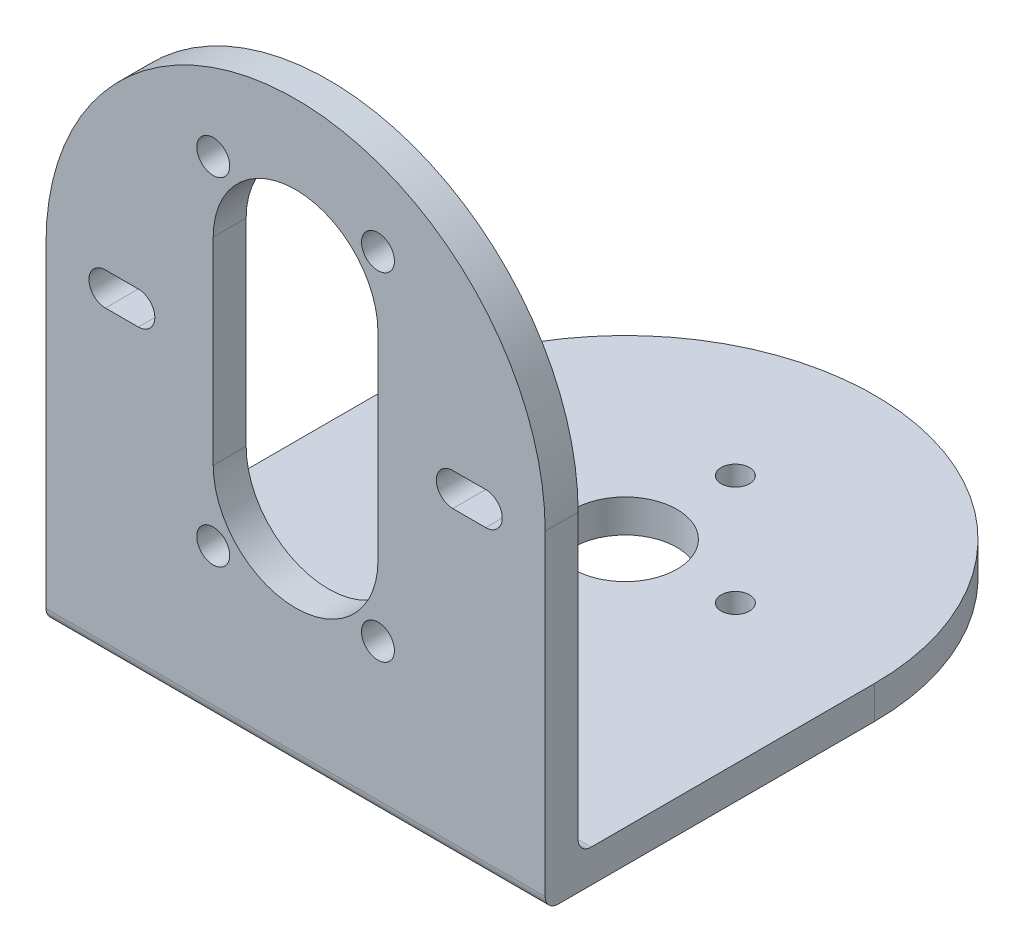
ISO-10303-21;
HEADER;
FILE_DESCRIPTION(('STEP AP214'),'2;1');
FILE_NAME('part.step','',(''),(''),'','','');
FILE_SCHEMA(('AUTOMOTIVE_DESIGN { 1 0 10303 214 1 1 1 1 }'));
ENDSEC;
DATA;
#1=APPLICATION_CONTEXT('core data for automotive mechanical design processes');
#2=APPLICATION_PROTOCOL_DEFINITION('international standard','automotive_design',2000,#1);
#3=PRODUCT_CONTEXT('',#1,'mechanical');
#4=PRODUCT('Part','Part','',(#3));
#5=PRODUCT_RELATED_PRODUCT_CATEGORY('part','',(#4));
#6=PRODUCT_DEFINITION_FORMATION('','',#4);
#7=PRODUCT_DEFINITION_CONTEXT('part definition',#1,'design');
#8=PRODUCT_DEFINITION('design','',#6,#7);
#9=PRODUCT_DEFINITION_SHAPE('','',#8);
#10=(LENGTH_UNIT() NAMED_UNIT(*) SI_UNIT(.MILLI.,.METRE.));
#11=(NAMED_UNIT(*) PLANE_ANGLE_UNIT() SI_UNIT($,.RADIAN.));
#12=(NAMED_UNIT(*) SI_UNIT($,.STERADIAN.) SOLID_ANGLE_UNIT());
#13=UNCERTAINTY_MEASURE_WITH_UNIT(LENGTH_MEASURE(1.E-05),#10,'distance_accuracy_value','');
#14=(GEOMETRIC_REPRESENTATION_CONTEXT(3) GLOBAL_UNCERTAINTY_ASSIGNED_CONTEXT((#13)) GLOBAL_UNIT_ASSIGNED_CONTEXT((#10,
#11,#12)) REPRESENTATION_CONTEXT('',''));
#15=CARTESIAN_POINT('',(0.,0.,0.));
#16=DIRECTION('',(0.,0.,1.));
#17=DIRECTION('',(1.,0.,0.));
#18=AXIS2_PLACEMENT_3D('',#15,#16,#17);
#19=CARTESIAN_POINT('',(0.,2.54,0.));
#20=DIRECTION('',(0.,1.,0.));
#21=DIRECTION('',(0.,0.,1.));
#22=AXIS2_PLACEMENT_3D('',#19,#20,#21);
#23=PLANE('',#22);
#24=CARTESIAN_POINT('',(-8.5,2.54,0.));
#25=DIRECTION('',(0.,1.,0.));
#26=DIRECTION('',(1.,0.,0.));
#27=AXIS2_PLACEMENT_3D('',#24,#25,#26);
#28=CIRCLE('',#27,1.09);
#29=CARTESIAN_POINT('',(-7.41,2.54,0.));
#30=VERTEX_POINT('',#29);
#31=EDGE_CURVE('E311',#30,#30,#28,.T.);
#32=ORIENTED_EDGE('',*,*,#31,.F.);
#33=EDGE_LOOP('',(#32));
#34=FACE_BOUND('',#33,.T.);
#35=CARTESIAN_POINT('',(0.,2.54,8.5));
#36=DIRECTION('',(0.,1.,0.));
#37=DIRECTION('',(0.,0.,-1.));
#38=AXIS2_PLACEMENT_3D('',#35,#36,#37);
#39=CIRCLE('',#38,1.09);
#40=CARTESIAN_POINT('',(0.,2.54,7.41));
#41=VERTEX_POINT('',#40);
#42=EDGE_CURVE('E320',#41,#41,#39,.T.);
#43=ORIENTED_EDGE('',*,*,#42,.F.);
#44=EDGE_LOOP('',(#43));
#45=FACE_BOUND('',#44,.T.);
#46=CARTESIAN_POINT('',(8.5,2.54,0.));
#47=DIRECTION('',(0.,1.,0.));
#48=DIRECTION('',(-1.,0.,0.));
#49=AXIS2_PLACEMENT_3D('',#46,#47,#48);
#50=CIRCLE('',#49,1.09);
#51=CARTESIAN_POINT('',(7.41,2.54,0.));
#52=VERTEX_POINT('',#51);
#53=EDGE_CURVE('E326',#52,#52,#50,.T.);
#54=ORIENTED_EDGE('',*,*,#53,.F.);
#55=EDGE_LOOP('',(#54));
#56=FACE_BOUND('',#55,.T.);
#57=CARTESIAN_POINT('',(0.,2.54,-8.5));
#58=DIRECTION('',(0.,1.,0.));
#59=DIRECTION('',(0.,0.,1.));
#60=AXIS2_PLACEMENT_3D('',#57,#58,#59);
#61=CIRCLE('',#60,1.09);
#62=CARTESIAN_POINT('',(0.,2.54,-7.41));
#63=VERTEX_POINT('',#62);
#64=EDGE_CURVE('E333',#63,#63,#61,.T.);
#65=ORIENTED_EDGE('',*,*,#64,.F.);
#66=EDGE_LOOP('',(#65));
#67=FACE_BOUND('',#66,.T.);
#68=CARTESIAN_POINT('',(0.,2.54,0.));
#69=DIRECTION('',(0.,1.,0.));
#70=DIRECTION('',(0.,0.,1.));
#71=AXIS2_PLACEMENT_3D('',#68,#69,#70);
#72=CIRCLE('',#71,4.);
#73=CARTESIAN_POINT('',(0.,2.54,4.));
#74=VERTEX_POINT('',#73);
#75=EDGE_CURVE('E337',#74,#74,#72,.T.);
#76=ORIENTED_EDGE('',*,*,#75,.F.);
#77=EDGE_LOOP('',(#76));
#78=FACE_BOUND('',#77,.T.);
#79=DIRECTION('',(0.,0.,1.));
#80=VECTOR('',#79,1.);
#81=CARTESIAN_POINT('',(-19.24,2.54,0.));
#82=LINE('',#81,#80);
#83=CARTESIAN_POINT('',(-19.24,2.54,0.));
#84=VERTEX_POINT('',#83);
#85=CARTESIAN_POINT('',(-19.24,2.54,21.86));
#86=VERTEX_POINT('',#85);
#87=EDGE_CURVE('E346',#84,#86,#82,.T.);
#88=ORIENTED_EDGE('',*,*,#87,.T.);
#89=DIRECTION('',(1.,0.,0.));
#90=VECTOR('',#89,1.);
#91=CARTESIAN_POINT('',(0.,2.54,21.86));
#92=LINE('',#91,#90);
#93=CARTESIAN_POINT('',(19.24,2.54,21.86));
#94=VERTEX_POINT('',#93);
#95=EDGE_CURVE('E371',#86,#94,#92,.T.);
#96=ORIENTED_EDGE('',*,*,#95,.T.);
#97=DIRECTION('',(0.,0.,-1.));
#98=VECTOR('',#97,1.);
#99=CARTESIAN_POINT('',(19.24,2.54,0.));
#100=LINE('',#99,#98);
#101=CARTESIAN_POINT('',(19.24,2.54,0.));
#102=VERTEX_POINT('',#101);
#103=EDGE_CURVE('E355',#94,#102,#100,.T.);
#104=ORIENTED_EDGE('',*,*,#103,.T.);
#105=CARTESIAN_POINT('',(0.,2.54,0.));
#106=DIRECTION('',(0.,1.,0.));
#107=DIRECTION('',(0.,0.,1.));
#108=AXIS2_PLACEMENT_3D('',#105,#106,#107);
#109=CIRCLE('',#108,19.24);
#110=EDGE_CURVE('E343',#102,#84,#109,.T.);
#111=ORIENTED_EDGE('',*,*,#110,.T.);
#112=EDGE_LOOP('',(#88,#96,#104,#111));
#113=FACE_BOUND('',#112,.T.);
#114=ADVANCED_FACE('F32',(#34,#45,#56,#67,#78,#113),#23,.T.);
#115=CARTESIAN_POINT('',(0.,0.,0.));
#116=DIRECTION('',(0.,1.,0.));
#117=DIRECTION('',(0.,0.,1.));
#118=AXIS2_PLACEMENT_3D('',#115,#116,#117);
#119=PLANE('',#118);
#120=CARTESIAN_POINT('',(-8.5,0.,0.));
#121=DIRECTION('',(0.,1.,0.));
#122=DIRECTION('',(1.,0.,0.));
#123=AXIS2_PLACEMENT_3D('',#120,#121,#122);
#124=CIRCLE('',#123,1.09);
#125=CARTESIAN_POINT('',(-7.41,0.,0.));
#126=VERTEX_POINT('',#125);
#127=EDGE_CURVE('E317',#126,#126,#124,.T.);
#128=ORIENTED_EDGE('',*,*,#127,.T.);
#129=EDGE_LOOP('',(#128));
#130=FACE_BOUND('',#129,.T.);
#131=CARTESIAN_POINT('',(0.,0.,8.5));
#132=DIRECTION('',(0.,1.,0.));
#133=DIRECTION('',(0.,0.,-1.));
#134=AXIS2_PLACEMENT_3D('',#131,#132,#133);
#135=CIRCLE('',#134,1.09);
#136=CARTESIAN_POINT('',(0.,0.,7.41));
#137=VERTEX_POINT('',#136);
#138=EDGE_CURVE('E323',#137,#137,#135,.T.);
#139=ORIENTED_EDGE('',*,*,#138,.T.);
#140=EDGE_LOOP('',(#139));
#141=FACE_BOUND('',#140,.T.);
#142=CARTESIAN_POINT('',(8.5,0.,0.));
#143=DIRECTION('',(0.,1.,0.));
#144=DIRECTION('',(-1.,0.,0.));
#145=AXIS2_PLACEMENT_3D('',#142,#143,#144);
#146=CIRCLE('',#145,1.09);
#147=CARTESIAN_POINT('',(7.41,0.,0.));
#148=VERTEX_POINT('',#147);
#149=EDGE_CURVE('E329',#148,#148,#146,.T.);
#150=ORIENTED_EDGE('',*,*,#149,.T.);
#151=EDGE_LOOP('',(#150));
#152=FACE_BOUND('',#151,.T.);
#153=CARTESIAN_POINT('',(0.,0.,-8.5));
#154=DIRECTION('',(0.,1.,0.));
#155=DIRECTION('',(0.,0.,1.));
#156=AXIS2_PLACEMENT_3D('',#153,#154,#155);
#157=CIRCLE('',#156,1.09);
#158=CARTESIAN_POINT('',(0.,0.,-7.41));
#159=VERTEX_POINT('',#158);
#160=EDGE_CURVE('E332',#159,#159,#157,.T.);
#161=ORIENTED_EDGE('',*,*,#160,.T.);
#162=EDGE_LOOP('',(#161));
#163=FACE_BOUND('',#162,.T.);
#164=DIRECTION('',(0.,0.,-1.));
#165=VECTOR('',#164,1.);
#166=CARTESIAN_POINT('',(19.24,0.,0.));
#167=LINE('',#166,#165);
#168=CARTESIAN_POINT('',(19.24,0.,24.4));
#169=VERTEX_POINT('',#168);
#170=CARTESIAN_POINT('',(19.24,0.,0.));
#171=VERTEX_POINT('',#170);
#172=EDGE_CURVE('E347',#169,#171,#167,.T.);
#173=ORIENTED_EDGE('',*,*,#172,.F.);
#174=DIRECTION('',(1.,0.,0.));
#175=VECTOR('',#174,1.);
#176=CARTESIAN_POINT('',(0.,0.,24.4));
#177=LINE('',#176,#175);
#178=CARTESIAN_POINT('',(-19.24,0.,24.4));
#179=VERTEX_POINT('',#178);
#180=EDGE_CURVE('E366',#169,#179,#177,.F.);
#181=ORIENTED_EDGE('',*,*,#180,.T.);
#182=DIRECTION('',(0.,0.,1.));
#183=VECTOR('',#182,1.);
#184=CARTESIAN_POINT('',(-19.24,0.,0.));
#185=LINE('',#184,#183);
#186=CARTESIAN_POINT('',(-19.24,0.,0.));
#187=VERTEX_POINT('',#186);
#188=EDGE_CURVE('E391',#187,#179,#185,.T.);
#189=ORIENTED_EDGE('',*,*,#188,.F.);
#190=CARTESIAN_POINT('',(0.,0.,0.));
#191=DIRECTION('',(0.,1.,0.));
#192=DIRECTION('',(0.,0.,1.));
#193=AXIS2_PLACEMENT_3D('',#190,#191,#192);
#194=CIRCLE('',#193,19.24);
#195=EDGE_CURVE('E340',#171,#187,#194,.T.);
#196=ORIENTED_EDGE('',*,*,#195,.F.);
#197=EDGE_LOOP('',(#173,#181,#189,#196));
#198=FACE_BOUND('',#197,.T.);
#199=CARTESIAN_POINT('',(0.,0.,0.));
#200=DIRECTION('',(0.,1.,0.));
#201=DIRECTION('',(0.,0.,1.));
#202=AXIS2_PLACEMENT_3D('',#199,#200,#201);
#203=CIRCLE('',#202,4.);
#204=CARTESIAN_POINT('',(0.,0.,4.));
#205=VERTEX_POINT('',#204);
#206=EDGE_CURVE('E336',#205,#205,#203,.T.);
#207=ORIENTED_EDGE('',*,*,#206,.T.);
#208=EDGE_LOOP('',(#207));
#209=FACE_BOUND('',#208,.T.);
#210=ADVANCED_FACE('F418',(#130,#141,#152,#163,#198,#209),#119,.F.);
#211=CARTESIAN_POINT('',(0.,2.54,0.));
#212=DIRECTION('',(0.,-1.,0.));
#213=DIRECTION('',(0.,0.,-1.));
#214=AXIS2_PLACEMENT_3D('',#211,#212,#213);
#215=CYLINDRICAL_SURFACE('',#214,19.24);
#216=ORIENTED_EDGE('',*,*,#195,.T.);
#217=DIRECTION('',(0.,-1.,0.));
#218=VECTOR('',#217,1.);
#219=CARTESIAN_POINT('',(-19.24,2.54,0.));
#220=LINE('',#219,#218);
#221=EDGE_CURVE('E389',#84,#187,#220,.T.);
#222=ORIENTED_EDGE('',*,*,#221,.F.);
#223=ORIENTED_EDGE('',*,*,#110,.F.);
#224=DIRECTION('',(0.,-1.,0.));
#225=VECTOR('',#224,1.);
#226=CARTESIAN_POINT('',(19.24,2.54,0.));
#227=LINE('',#226,#225);
#228=EDGE_CURVE('E398',#102,#171,#227,.T.);
#229=ORIENTED_EDGE('',*,*,#228,.T.);
#230=EDGE_LOOP('',(#216,#222,#223,#229));
#231=FACE_BOUND('',#230,.T.);
#232=ADVANCED_FACE('F397',(#231),#215,.T.);
#233=CARTESIAN_POINT('',(-19.24,2.54,0.));
#234=DIRECTION('',(1.,0.,0.));
#235=DIRECTION('',(0.,0.,-1.));
#236=AXIS2_PLACEMENT_3D('',#233,#234,#235);
#237=PLANE('',#236);
#238=ORIENTED_EDGE('',*,*,#188,.T.);
#239=CARTESIAN_POINT('',(-19.24,1.,24.4));
#240=DIRECTION('',(1.,0.,0.));
#241=DIRECTION('',(0.,0.,-1.));
#242=AXIS2_PLACEMENT_3D('',#239,#240,#241);
#243=CIRCLE('',#242,1.);
#244=CARTESIAN_POINT('',(-19.24,1.,25.4));
#245=VERTEX_POINT('',#244);
#246=EDGE_CURVE('E369',#179,#245,#243,.F.);
#247=ORIENTED_EDGE('',*,*,#246,.T.);
#248=DIRECTION('',(0.,-1.,0.));
#249=VECTOR('',#248,1.);
#250=CARTESIAN_POINT('',(-19.24,2.54,25.4));
#251=LINE('',#250,#249);
#252=CARTESIAN_POINT('',(-19.24,25.4,25.4));
#253=VERTEX_POINT('',#252);
#254=EDGE_CURVE('E394',#253,#245,#251,.T.);
#255=ORIENTED_EDGE('',*,*,#254,.F.);
#256=DIRECTION('',(0.,0.,1.));
#257=VECTOR('',#256,1.);
#258=CARTESIAN_POINT('',(-19.24,25.4,22.86));
#259=LINE('',#258,#257);
#260=CARTESIAN_POINT('',(-19.24,25.4,22.86));
#261=VERTEX_POINT('',#260);
#262=EDGE_CURVE('E308',#261,#253,#259,.T.);
#263=ORIENTED_EDGE('',*,*,#262,.F.);
#264=DIRECTION('',(0.,-1.,0.));
#265=VECTOR('',#264,1.);
#266=CARTESIAN_POINT('',(-19.24,2.54,22.86));
#267=LINE('',#266,#265);
#268=CARTESIAN_POINT('',(-19.24,3.54,22.86));
#269=VERTEX_POINT('',#268);
#270=EDGE_CURVE('E304',#261,#269,#267,.T.);
#271=ORIENTED_EDGE('',*,*,#270,.T.);
#272=CARTESIAN_POINT('',(-19.24,3.54,21.86));
#273=DIRECTION('',(1.,0.,0.));
#274=DIRECTION('',(0.,0.,-1.));
#275=AXIS2_PLACEMENT_3D('',#272,#273,#274);
#276=CIRCLE('',#275,1.);
#277=EDGE_CURVE('E11',#269,#86,#276,.T.);
#278=ORIENTED_EDGE('',*,*,#277,.T.);
#279=ORIENTED_EDGE('',*,*,#87,.F.);
#280=ORIENTED_EDGE('',*,*,#221,.T.);
#281=EDGE_LOOP('',(#238,#247,#255,#263,#271,#278,#279,#280));
#282=FACE_BOUND('',#281,.T.);
#283=ADVANCED_FACE('F388',(#282),#237,.F.);
#284=CARTESIAN_POINT('',(19.24,2.54,25.4));
#285=DIRECTION('',(0.,0.,-1.));
#286=DIRECTION('',(-1.,0.,0.));
#287=AXIS2_PLACEMENT_3D('',#284,#285,#286);
#288=PLANE('',#287);
#289=ORIENTED_EDGE('',*,*,#254,.T.);
#290=DIRECTION('',(1.,0.,0.));
#291=VECTOR('',#290,1.);
#292=CARTESIAN_POINT('',(19.24,1.,25.4));
#293=LINE('',#292,#291);
#294=CARTESIAN_POINT('',(19.24,1.,25.4));
#295=VERTEX_POINT('',#294);
#296=EDGE_CURVE('E367',#245,#295,#293,.T.);
#297=ORIENTED_EDGE('',*,*,#296,.T.);
#298=DIRECTION('',(0.,-1.,0.));
#299=VECTOR('',#298,1.);
#300=CARTESIAN_POINT('',(19.24,2.54,25.4));
#301=LINE('',#300,#299);
#302=CARTESIAN_POINT('',(19.24,25.4,25.4));
#303=VERTEX_POINT('',#302);
#304=EDGE_CURVE('E405',#303,#295,#301,.T.);
#305=ORIENTED_EDGE('',*,*,#304,.F.);
#306=CARTESIAN_POINT('',(0.,25.4,25.4));
#307=DIRECTION('',(0.,0.,1.));
#308=DIRECTION('',(1.,0.,0.));
#309=AXIS2_PLACEMENT_3D('',#306,#307,#308);
#310=CIRCLE('',#309,19.24);
#311=EDGE_CURVE('E294',#303,#253,#310,.T.);
#312=ORIENTED_EDGE('',*,*,#311,.T.);
#313=EDGE_LOOP('',(#289,#297,#305,#312));
#314=FACE_BOUND('',#313,.T.);
#315=CARTESIAN_POINT('',(-14.66,24.62,25.4));
#316=DIRECTION('',(0.,0.,1.));
#317=DIRECTION('',(1.,0.,0.));
#318=AXIS2_PLACEMENT_3D('',#315,#316,#317);
#319=CIRCLE('',#318,1.27);
#320=CARTESIAN_POINT('',(-14.66,25.89,25.4));
#321=VERTEX_POINT('',#320);
#322=CARTESIAN_POINT('',(-14.66,23.35,25.4));
#323=VERTEX_POINT('',#322);
#324=EDGE_CURVE('E176',#321,#323,#319,.T.);
#325=ORIENTED_EDGE('',*,*,#324,.F.);
#326=DIRECTION('',(-1.,0.,0.));
#327=VECTOR('',#326,1.);
#328=CARTESIAN_POINT('',(-14.66,25.89,25.4));
#329=LINE('',#328,#327);
#330=CARTESIAN_POINT('',(-12.12,25.89,25.4));
#331=VERTEX_POINT('',#330);
#332=EDGE_CURVE('E194',#331,#321,#329,.T.);
#333=ORIENTED_EDGE('',*,*,#332,.F.);
#334=CARTESIAN_POINT('',(-12.12,24.62,25.4));
#335=DIRECTION('',(0.,0.,1.));
#336=DIRECTION('',(-1.,0.,0.));
#337=AXIS2_PLACEMENT_3D('',#334,#335,#336);
#338=CIRCLE('',#337,1.27);
#339=CARTESIAN_POINT('',(-12.12,23.35,25.4));
#340=VERTEX_POINT('',#339);
#341=EDGE_CURVE('E197',#340,#331,#338,.T.);
#342=ORIENTED_EDGE('',*,*,#341,.F.);
#343=DIRECTION('',(1.,0.,0.));
#344=VECTOR('',#343,1.);
#345=CARTESIAN_POINT('',(-14.66,23.35,25.4));
#346=LINE('',#345,#344);
#347=EDGE_CURVE('E203',#323,#340,#346,.T.);
#348=ORIENTED_EDGE('',*,*,#347,.F.);
#349=EDGE_LOOP('',(#325,#333,#342,#348));
#350=FACE_BOUND('',#349,.T.);
#351=CARTESIAN_POINT('',(14.66,24.62,25.4));
#352=DIRECTION('',(0.,0.,1.));
#353=DIRECTION('',(-1.,0.,0.));
#354=AXIS2_PLACEMENT_3D('',#351,#352,#353);
#355=CIRCLE('',#354,1.27);
#356=CARTESIAN_POINT('',(14.66,23.35,25.4));
#357=VERTEX_POINT('',#356);
#358=CARTESIAN_POINT('',(14.66,25.89,25.4));
#359=VERTEX_POINT('',#358);
#360=EDGE_CURVE('E209',#357,#359,#355,.T.);
#361=ORIENTED_EDGE('',*,*,#360,.F.);
#362=DIRECTION('',(1.,0.,0.));
#363=VECTOR('',#362,1.);
#364=CARTESIAN_POINT('',(14.66,23.35,25.4));
#365=LINE('',#364,#363);
#366=CARTESIAN_POINT('',(12.12,23.35,25.4));
#367=VERTEX_POINT('',#366);
#368=EDGE_CURVE('E217',#367,#357,#365,.T.);
#369=ORIENTED_EDGE('',*,*,#368,.F.);
#370=CARTESIAN_POINT('',(12.12,24.62,25.4));
#371=DIRECTION('',(0.,0.,1.));
#372=DIRECTION('',(1.,0.,0.));
#373=AXIS2_PLACEMENT_3D('',#370,#371,#372);
#374=CIRCLE('',#373,1.27);
#375=CARTESIAN_POINT('',(12.12,25.89,25.4));
#376=VERTEX_POINT('',#375);
#377=EDGE_CURVE('E231',#376,#367,#374,.T.);
#378=ORIENTED_EDGE('',*,*,#377,.F.);
#379=DIRECTION('',(-1.,0.,0.));
#380=VECTOR('',#379,1.);
#381=CARTESIAN_POINT('',(14.66,25.89,25.4));
#382=LINE('',#381,#380);
#383=EDGE_CURVE('E228',#359,#376,#382,.T.);
#384=ORIENTED_EDGE('',*,*,#383,.F.);
#385=EDGE_LOOP('',(#361,#369,#378,#384));
#386=FACE_BOUND('',#385,.T.);
#387=CARTESIAN_POINT('',(-6.35,37.62,25.4));
#388=DIRECTION('',(0.,0.,1.));
#389=DIRECTION('',(-1.,0.,0.));
#390=AXIS2_PLACEMENT_3D('',#387,#388,#389);
#391=CIRCLE('',#390,1.27);
#392=CARTESIAN_POINT('',(-7.61999999999999,37.62,25.4));
#393=VERTEX_POINT('',#392);
#394=EDGE_CURVE('E238',#393,#393,#391,.T.);
#395=ORIENTED_EDGE('',*,*,#394,.F.);
#396=EDGE_LOOP('',(#395));
#397=FACE_BOUND('',#396,.T.);
#398=CARTESIAN_POINT('',(-6.35000000000001,11.62,25.4));
#399=DIRECTION('',(0.,0.,1.));
#400=DIRECTION('',(-1.,0.,0.));
#401=AXIS2_PLACEMENT_3D('',#398,#399,#400);
#402=CIRCLE('',#401,1.27);
#403=CARTESIAN_POINT('',(-7.62000000000001,11.62,25.4));
#404=VERTEX_POINT('',#403);
#405=EDGE_CURVE('E248',#404,#404,#402,.T.);
#406=ORIENTED_EDGE('',*,*,#405,.F.);
#407=EDGE_LOOP('',(#406));
#408=FACE_BOUND('',#407,.T.);
#409=CARTESIAN_POINT('',(6.35000000000001,11.62,25.4));
#410=DIRECTION('',(0.,0.,1.));
#411=DIRECTION('',(1.,0.,0.));
#412=AXIS2_PLACEMENT_3D('',#409,#410,#411);
#413=CIRCLE('',#412,1.27);
#414=CARTESIAN_POINT('',(7.62000000000001,11.62,25.4));
#415=VERTEX_POINT('',#414);
#416=EDGE_CURVE('E254',#415,#415,#413,.T.);
#417=ORIENTED_EDGE('',*,*,#416,.F.);
#418=EDGE_LOOP('',(#417));
#419=FACE_BOUND('',#418,.T.);
#420=CARTESIAN_POINT('',(6.35,37.62,25.4));
#421=DIRECTION('',(0.,0.,1.));
#422=DIRECTION('',(1.,0.,0.));
#423=AXIS2_PLACEMENT_3D('',#420,#421,#422);
#424=CIRCLE('',#423,1.27);
#425=CARTESIAN_POINT('',(7.62,37.62,25.4));
#426=VERTEX_POINT('',#425);
#427=EDGE_CURVE('E260',#426,#426,#424,.T.);
#428=ORIENTED_EDGE('',*,*,#427,.F.);
#429=EDGE_LOOP('',(#428));
#430=FACE_BOUND('',#429,.T.);
#431=CARTESIAN_POINT('',(0.,32.24,25.4));
#432=DIRECTION('',(0.,0.,1.));
#433=DIRECTION('',(1.,0.,0.));
#434=AXIS2_PLACEMENT_3D('',#431,#432,#433);
#435=CIRCLE('',#434,6.35);
#436=CARTESIAN_POINT('',(6.35,32.24,25.4));
#437=VERTEX_POINT('',#436);
#438=CARTESIAN_POINT('',(-6.35,32.24,25.4));
#439=VERTEX_POINT('',#438);
#440=EDGE_CURVE('E266',#437,#439,#435,.T.);
#441=ORIENTED_EDGE('',*,*,#440,.F.);
#442=DIRECTION('',(0.,1.,0.));
#443=VECTOR('',#442,1.);
#444=CARTESIAN_POINT('',(6.35,32.24,25.4));
#445=LINE('',#444,#443);
#446=CARTESIAN_POINT('',(6.35,17.,25.4));
#447=VERTEX_POINT('',#446);
#448=EDGE_CURVE('E273',#447,#437,#445,.T.);
#449=ORIENTED_EDGE('',*,*,#448,.F.);
#450=CARTESIAN_POINT('',(0.,17.,25.4));
#451=DIRECTION('',(0.,0.,1.));
#452=DIRECTION('',(-1.,0.,0.));
#453=AXIS2_PLACEMENT_3D('',#450,#451,#452);
#454=CIRCLE('',#453,6.35);
#455=CARTESIAN_POINT('',(-6.35,17.,25.4));
#456=VERTEX_POINT('',#455);
#457=EDGE_CURVE('E287',#456,#447,#454,.T.);
#458=ORIENTED_EDGE('',*,*,#457,.F.);
#459=DIRECTION('',(0.,-1.,0.));
#460=VECTOR('',#459,1.);
#461=CARTESIAN_POINT('',(-6.35,32.24,25.4));
#462=LINE('',#461,#460);
#463=EDGE_CURVE('E284',#439,#456,#462,.T.);
#464=ORIENTED_EDGE('',*,*,#463,.F.);
#465=EDGE_LOOP('',(#441,#449,#458,#464));
#466=FACE_BOUND('',#465,.T.);
#467=ADVANCED_FACE('F411',(#314,#350,#386,#397,#408,#419,#430,#466),#288,.F.);
#468=CARTESIAN_POINT('',(19.24,2.54,0.));
#469=DIRECTION('',(-1.,0.,0.));
#470=DIRECTION('',(0.,0.,1.));
#471=AXIS2_PLACEMENT_3D('',#468,#469,#470);
#472=PLANE('',#471);
#473=ORIENTED_EDGE('',*,*,#304,.T.);
#474=CARTESIAN_POINT('',(19.24,1.,24.4));
#475=DIRECTION('',(-1.,0.,0.));
#476=DIRECTION('',(0.,0.,1.));
#477=AXIS2_PLACEMENT_3D('',#474,#475,#476);
#478=CIRCLE('',#477,1.);
#479=EDGE_CURVE('E364',#295,#169,#478,.F.);
#480=ORIENTED_EDGE('',*,*,#479,.T.);
#481=ORIENTED_EDGE('',*,*,#172,.T.);
#482=ORIENTED_EDGE('',*,*,#228,.F.);
#483=ORIENTED_EDGE('',*,*,#103,.F.);
#484=CARTESIAN_POINT('',(19.24,3.54,21.86));
#485=DIRECTION('',(-1.,0.,0.));
#486=DIRECTION('',(0.,0.,1.));
#487=AXIS2_PLACEMENT_3D('',#484,#485,#486);
#488=CIRCLE('',#487,1.);
#489=CARTESIAN_POINT('',(19.24,3.54,22.86));
#490=VERTEX_POINT('',#489);
#491=EDGE_CURVE('E40',#94,#490,#488,.T.);
#492=ORIENTED_EDGE('',*,*,#491,.T.);
#493=DIRECTION('',(0.,1.,0.));
#494=VECTOR('',#493,1.);
#495=CARTESIAN_POINT('',(19.24,2.54,22.86));
#496=LINE('',#495,#494);
#497=CARTESIAN_POINT('',(19.24,25.4,22.86));
#498=VERTEX_POINT('',#497);
#499=EDGE_CURVE('E305',#490,#498,#496,.T.);
#500=ORIENTED_EDGE('',*,*,#499,.T.);
#501=DIRECTION('',(0.,0.,1.));
#502=VECTOR('',#501,1.);
#503=CARTESIAN_POINT('',(19.24,25.4,22.86));
#504=LINE('',#503,#502);
#505=EDGE_CURVE('E312',#498,#303,#504,.T.);
#506=ORIENTED_EDGE('',*,*,#505,.T.);
#507=EDGE_LOOP('',(#473,#480,#481,#482,#483,#492,#500,#506));
#508=FACE_BOUND('',#507,.T.);
#509=ADVANCED_FACE('F377',(#508),#472,.F.);
#510=CARTESIAN_POINT('',(0.,2.54,0.));
#511=DIRECTION('',(0.,-1.,0.));
#512=DIRECTION('',(0.,0.,-1.));
#513=AXIS2_PLACEMENT_3D('',#510,#511,#512);
#514=CYLINDRICAL_SURFACE('',#513,4.);
#515=ORIENTED_EDGE('',*,*,#75,.T.);
#516=EDGE_LOOP('',(#515));
#517=FACE_BOUND('',#516,.T.);
#518=ORIENTED_EDGE('',*,*,#206,.F.);
#519=EDGE_LOOP('',(#518));
#520=FACE_BOUND('',#519,.T.);
#521=ADVANCED_FACE('F425',(#517,#520),#514,.F.);
#522=CARTESIAN_POINT('',(0.,-2.46,-8.5));
#523=DIRECTION('',(0.,1.,0.));
#524=DIRECTION('',(0.,0.,1.));
#525=AXIS2_PLACEMENT_3D('',#522,#523,#524);
#526=CYLINDRICAL_SURFACE('',#525,1.09);
#527=ORIENTED_EDGE('',*,*,#64,.T.);
#528=EDGE_LOOP('',(#527));
#529=FACE_BOUND('',#528,.T.);
#530=ORIENTED_EDGE('',*,*,#160,.F.);
#531=EDGE_LOOP('',(#530));
#532=FACE_BOUND('',#531,.T.);
#533=ADVANCED_FACE('F427',(#529,#532),#526,.F.);
#534=CARTESIAN_POINT('',(8.5,-2.46,0.));
#535=DIRECTION('',(0.,1.,0.));
#536=DIRECTION('',(-1.,0.,0.));
#537=AXIS2_PLACEMENT_3D('',#534,#535,#536);
#538=CYLINDRICAL_SURFACE('',#537,1.09);
#539=ORIENTED_EDGE('',*,*,#53,.T.);
#540=EDGE_LOOP('',(#539));
#541=FACE_BOUND('',#540,.T.);
#542=ORIENTED_EDGE('',*,*,#149,.F.);
#543=EDGE_LOOP('',(#542));
#544=FACE_BOUND('',#543,.T.);
#545=ADVANCED_FACE('F434',(#541,#544),#538,.F.);
#546=CARTESIAN_POINT('',(0.,-2.46,8.5));
#547=DIRECTION('',(0.,1.,0.));
#548=DIRECTION('',(0.,0.,-1.));
#549=AXIS2_PLACEMENT_3D('',#546,#547,#548);
#550=CYLINDRICAL_SURFACE('',#549,1.09);
#551=ORIENTED_EDGE('',*,*,#42,.T.);
#552=EDGE_LOOP('',(#551));
#553=FACE_BOUND('',#552,.T.);
#554=ORIENTED_EDGE('',*,*,#138,.F.);
#555=EDGE_LOOP('',(#554));
#556=FACE_BOUND('',#555,.T.);
#557=ADVANCED_FACE('F525',(#553,#556),#550,.F.);
#558=CARTESIAN_POINT('',(-8.5,-2.46,0.));
#559=DIRECTION('',(0.,1.,0.));
#560=DIRECTION('',(1.,0.,0.));
#561=AXIS2_PLACEMENT_3D('',#558,#559,#560);
#562=CYLINDRICAL_SURFACE('',#561,1.09);
#563=ORIENTED_EDGE('',*,*,#31,.T.);
#564=EDGE_LOOP('',(#563));
#565=FACE_BOUND('',#564,.T.);
#566=ORIENTED_EDGE('',*,*,#127,.F.);
#567=EDGE_LOOP('',(#566));
#568=FACE_BOUND('',#567,.T.);
#569=ADVANCED_FACE('F521',(#565,#568),#562,.F.);
#570=CARTESIAN_POINT('',(0.,25.4,22.86));
#571=DIRECTION('',(0.,0.,1.));
#572=DIRECTION('',(1.,0.,0.));
#573=AXIS2_PLACEMENT_3D('',#570,#571,#572);
#574=CYLINDRICAL_SURFACE('',#573,19.24);
#575=ORIENTED_EDGE('',*,*,#311,.F.);
#576=ORIENTED_EDGE('',*,*,#505,.F.);
#577=CARTESIAN_POINT('',(0.,25.4,22.86));
#578=DIRECTION('',(0.,0.,1.));
#579=DIRECTION('',(1.,0.,0.));
#580=AXIS2_PLACEMENT_3D('',#577,#578,#579);
#581=CIRCLE('',#580,19.24);
#582=EDGE_CURVE('E301',#498,#261,#581,.T.);
#583=ORIENTED_EDGE('',*,*,#582,.T.);
#584=ORIENTED_EDGE('',*,*,#262,.T.);
#585=EDGE_LOOP('',(#575,#576,#583,#584));
#586=FACE_BOUND('',#585,.T.);
#587=ADVANCED_FACE('F518',(#586),#574,.T.);
#588=CARTESIAN_POINT('',(0.,25.4,22.86));
#589=DIRECTION('',(0.,0.,1.));
#590=DIRECTION('',(1.,0.,0.));
#591=AXIS2_PLACEMENT_3D('',#588,#589,#590);
#592=PLANE('',#591);
#593=DIRECTION('',(-1.,0.,0.));
#594=VECTOR('',#593,1.);
#595=CARTESIAN_POINT('',(-14.66,25.89,22.86));
#596=LINE('',#595,#594);
#597=CARTESIAN_POINT('',(-12.12,25.89,22.86));
#598=VERTEX_POINT('',#597);
#599=CARTESIAN_POINT('',(-14.66,25.89,22.86));
#600=VERTEX_POINT('',#599);
#601=EDGE_CURVE('E181',#598,#600,#596,.T.);
#602=ORIENTED_EDGE('',*,*,#601,.T.);
#603=CARTESIAN_POINT('',(-14.66,24.62,22.86));
#604=DIRECTION('',(0.,0.,1.));
#605=DIRECTION('',(1.,0.,0.));
#606=AXIS2_PLACEMENT_3D('',#603,#604,#605);
#607=CIRCLE('',#606,1.27);
#608=CARTESIAN_POINT('',(-14.66,23.35,22.86));
#609=VERTEX_POINT('',#608);
#610=EDGE_CURVE('E173',#600,#609,#607,.T.);
#611=ORIENTED_EDGE('',*,*,#610,.T.);
#612=DIRECTION('',(1.,0.,0.));
#613=VECTOR('',#612,1.);
#614=CARTESIAN_POINT('',(-14.66,23.35,22.86));
#615=LINE('',#614,#613);
#616=CARTESIAN_POINT('',(-12.12,23.35,22.86));
#617=VERTEX_POINT('',#616);
#618=EDGE_CURVE('E185',#609,#617,#615,.T.);
#619=ORIENTED_EDGE('',*,*,#618,.T.);
#620=CARTESIAN_POINT('',(-12.12,24.62,22.86));
#621=DIRECTION('',(0.,0.,1.));
#622=DIRECTION('',(-1.,0.,0.));
#623=AXIS2_PLACEMENT_3D('',#620,#621,#622);
#624=CIRCLE('',#623,1.27);
#625=EDGE_CURVE('E189',#617,#598,#624,.T.);
#626=ORIENTED_EDGE('',*,*,#625,.T.);
#627=EDGE_LOOP('',(#602,#611,#619,#626));
#628=FACE_BOUND('',#627,.T.);
#629=DIRECTION('',(1.,0.,0.));
#630=VECTOR('',#629,1.);
#631=CARTESIAN_POINT('',(14.66,23.35,22.86));
#632=LINE('',#631,#630);
#633=CARTESIAN_POINT('',(12.12,23.35,22.86));
#634=VERTEX_POINT('',#633);
#635=CARTESIAN_POINT('',(14.66,23.35,22.86));
#636=VERTEX_POINT('',#635);
#637=EDGE_CURVE('E223',#634,#636,#632,.T.);
#638=ORIENTED_EDGE('',*,*,#637,.T.);
#639=CARTESIAN_POINT('',(14.66,24.62,22.86));
#640=DIRECTION('',(0.,0.,1.));
#641=DIRECTION('',(-1.,0.,0.));
#642=AXIS2_PLACEMENT_3D('',#639,#640,#641);
#643=CIRCLE('',#642,1.27);
#644=CARTESIAN_POINT('',(14.66,25.89,22.86));
#645=VERTEX_POINT('',#644);
#646=EDGE_CURVE('E213',#636,#645,#643,.T.);
#647=ORIENTED_EDGE('',*,*,#646,.T.);
#648=DIRECTION('',(-1.,0.,0.));
#649=VECTOR('',#648,1.);
#650=CARTESIAN_POINT('',(14.66,25.89,22.86));
#651=LINE('',#650,#649);
#652=CARTESIAN_POINT('',(12.12,25.89,22.86));
#653=VERTEX_POINT('',#652);
#654=EDGE_CURVE('E216',#645,#653,#651,.T.);
#655=ORIENTED_EDGE('',*,*,#654,.T.);
#656=CARTESIAN_POINT('',(12.12,24.62,22.86));
#657=DIRECTION('',(0.,0.,1.));
#658=DIRECTION('',(1.,0.,0.));
#659=AXIS2_PLACEMENT_3D('',#656,#657,#658);
#660=CIRCLE('',#659,1.27);
#661=EDGE_CURVE('E220',#653,#634,#660,.T.);
#662=ORIENTED_EDGE('',*,*,#661,.T.);
#663=EDGE_LOOP('',(#638,#647,#655,#662));
#664=FACE_BOUND('',#663,.T.);
#665=CARTESIAN_POINT('',(-6.35,37.62,22.86));
#666=DIRECTION('',(0.,0.,1.));
#667=DIRECTION('',(-1.,0.,0.));
#668=AXIS2_PLACEMENT_3D('',#665,#666,#667);
#669=CIRCLE('',#668,1.27);
#670=CARTESIAN_POINT('',(-7.61999999999999,37.62,22.86));
#671=VERTEX_POINT('',#670);
#672=EDGE_CURVE('E245',#671,#671,#669,.T.);
#673=ORIENTED_EDGE('',*,*,#672,.T.);
#674=EDGE_LOOP('',(#673));
#675=FACE_BOUND('',#674,.T.);
#676=CARTESIAN_POINT('',(-6.35000000000001,11.62,22.86));
#677=DIRECTION('',(0.,0.,1.));
#678=DIRECTION('',(-1.,0.,0.));
#679=AXIS2_PLACEMENT_3D('',#676,#677,#678);
#680=CIRCLE('',#679,1.27);
#681=CARTESIAN_POINT('',(-7.62000000000001,11.62,22.86));
#682=VERTEX_POINT('',#681);
#683=EDGE_CURVE('E251',#682,#682,#680,.T.);
#684=ORIENTED_EDGE('',*,*,#683,.T.);
#685=EDGE_LOOP('',(#684));
#686=FACE_BOUND('',#685,.T.);
#687=CARTESIAN_POINT('',(6.35000000000001,11.62,22.86));
#688=DIRECTION('',(0.,0.,1.));
#689=DIRECTION('',(1.,0.,0.));
#690=AXIS2_PLACEMENT_3D('',#687,#688,#689);
#691=CIRCLE('',#690,1.27);
#692=CARTESIAN_POINT('',(7.62000000000001,11.62,22.86));
#693=VERTEX_POINT('',#692);
#694=EDGE_CURVE('E257',#693,#693,#691,.T.);
#695=ORIENTED_EDGE('',*,*,#694,.T.);
#696=EDGE_LOOP('',(#695));
#697=FACE_BOUND('',#696,.T.);
#698=CARTESIAN_POINT('',(6.35,37.62,22.86));
#699=DIRECTION('',(0.,0.,1.));
#700=DIRECTION('',(1.,0.,0.));
#701=AXIS2_PLACEMENT_3D('',#698,#699,#700);
#702=CIRCLE('',#701,1.27);
#703=CARTESIAN_POINT('',(7.62,37.62,22.86));
#704=VERTEX_POINT('',#703);
#705=EDGE_CURVE('E263',#704,#704,#702,.T.);
#706=ORIENTED_EDGE('',*,*,#705,.T.);
#707=EDGE_LOOP('',(#706));
#708=FACE_BOUND('',#707,.T.);
#709=DIRECTION('',(0.,1.,0.));
#710=VECTOR('',#709,1.);
#711=CARTESIAN_POINT('',(6.35,32.24,22.86));
#712=LINE('',#711,#710);
#713=CARTESIAN_POINT('',(6.35,17.,22.86));
#714=VERTEX_POINT('',#713);
#715=CARTESIAN_POINT('',(6.35,32.24,22.86));
#716=VERTEX_POINT('',#715);
#717=EDGE_CURVE('E279',#714,#716,#712,.T.);
#718=ORIENTED_EDGE('',*,*,#717,.T.);
#719=CARTESIAN_POINT('',(0.,32.24,22.86));
#720=DIRECTION('',(0.,0.,1.));
#721=DIRECTION('',(1.,0.,0.));
#722=AXIS2_PLACEMENT_3D('',#719,#720,#721);
#723=CIRCLE('',#722,6.35);
#724=CARTESIAN_POINT('',(-6.35,32.24,22.86));
#725=VERTEX_POINT('',#724);
#726=EDGE_CURVE('E269',#716,#725,#723,.T.);
#727=ORIENTED_EDGE('',*,*,#726,.T.);
#728=DIRECTION('',(0.,-1.,0.));
#729=VECTOR('',#728,1.);
#730=CARTESIAN_POINT('',(-6.35,32.24,22.86));
#731=LINE('',#730,#729);
#732=CARTESIAN_POINT('',(-6.35,17.,22.86));
#733=VERTEX_POINT('',#732);
#734=EDGE_CURVE('E272',#725,#733,#731,.T.);
#735=ORIENTED_EDGE('',*,*,#734,.T.);
#736=CARTESIAN_POINT('',(0.,17.,22.86));
#737=DIRECTION('',(0.,0.,1.));
#738=DIRECTION('',(-1.,0.,0.));
#739=AXIS2_PLACEMENT_3D('',#736,#737,#738);
#740=CIRCLE('',#739,6.35);
#741=EDGE_CURVE('E276',#733,#714,#740,.T.);
#742=ORIENTED_EDGE('',*,*,#741,.T.);
#743=EDGE_LOOP('',(#718,#727,#735,#742));
#744=FACE_BOUND('',#743,.T.);
#745=ORIENTED_EDGE('',*,*,#499,.F.);
#746=DIRECTION('',(1.,0.,0.));
#747=VECTOR('',#746,1.);
#748=CARTESIAN_POINT('',(0.,3.54,22.86));
#749=LINE('',#748,#747);
#750=EDGE_CURVE('E53',#490,#269,#749,.F.);
#751=ORIENTED_EDGE('',*,*,#750,.T.);
#752=ORIENTED_EDGE('',*,*,#270,.F.);
#753=ORIENTED_EDGE('',*,*,#582,.F.);
#754=EDGE_LOOP('',(#745,#751,#752,#753));
#755=FACE_BOUND('',#754,.T.);
#756=ADVANCED_FACE('F191',(#628,#664,#675,#686,#697,#708,#744,#755),#592,.F.);
#757=CARTESIAN_POINT('',(0.,32.24,22.86));
#758=DIRECTION('',(0.,0.,1.));
#759=DIRECTION('',(1.,0.,0.));
#760=AXIS2_PLACEMENT_3D('',#757,#758,#759);
#761=CYLINDRICAL_SURFACE('',#760,6.35);
#762=ORIENTED_EDGE('',*,*,#440,.T.);
#763=DIRECTION('',(0.,0.,1.));
#764=VECTOR('',#763,1.);
#765=CARTESIAN_POINT('',(-6.35,32.24,22.86));
#766=LINE('',#765,#764);
#767=EDGE_CURVE('E282',#725,#439,#766,.T.);
#768=ORIENTED_EDGE('',*,*,#767,.F.);
#769=ORIENTED_EDGE('',*,*,#726,.F.);
#770=DIRECTION('',(0.,0.,1.));
#771=VECTOR('',#770,1.);
#772=CARTESIAN_POINT('',(6.35,32.24,22.86));
#773=LINE('',#772,#771);
#774=EDGE_CURVE('E292',#716,#437,#773,.T.);
#775=ORIENTED_EDGE('',*,*,#774,.T.);
#776=EDGE_LOOP('',(#762,#768,#769,#775));
#777=FACE_BOUND('',#776,.T.);
#778=ADVANCED_FACE('F505',(#777),#761,.F.);
#779=CARTESIAN_POINT('',(6.35,32.24,22.86));
#780=DIRECTION('',(1.,0.,0.));
#781=DIRECTION('',(0.,1.,0.));
#782=AXIS2_PLACEMENT_3D('',#779,#780,#781);
#783=PLANE('',#782);
#784=ORIENTED_EDGE('',*,*,#448,.T.);
#785=ORIENTED_EDGE('',*,*,#774,.F.);
#786=ORIENTED_EDGE('',*,*,#717,.F.);
#787=DIRECTION('',(0.,0.,1.));
#788=VECTOR('',#787,1.);
#789=CARTESIAN_POINT('',(6.35,17.,22.86));
#790=LINE('',#789,#788);
#791=EDGE_CURVE('E295',#714,#447,#790,.T.);
#792=ORIENTED_EDGE('',*,*,#791,.T.);
#793=EDGE_LOOP('',(#784,#785,#786,#792));
#794=FACE_BOUND('',#793,.T.);
#795=ADVANCED_FACE('F501',(#794),#783,.F.);
#796=CARTESIAN_POINT('',(0.,17.,22.86));
#797=DIRECTION('',(0.,0.,1.));
#798=DIRECTION('',(1.,0.,0.));
#799=AXIS2_PLACEMENT_3D('',#796,#797,#798);
#800=CYLINDRICAL_SURFACE('',#799,6.35);
#801=ORIENTED_EDGE('',*,*,#457,.T.);
#802=ORIENTED_EDGE('',*,*,#791,.F.);
#803=ORIENTED_EDGE('',*,*,#741,.F.);
#804=DIRECTION('',(0.,0.,1.));
#805=VECTOR('',#804,1.);
#806=CARTESIAN_POINT('',(-6.35,17.,22.86));
#807=LINE('',#806,#805);
#808=EDGE_CURVE('E297',#733,#456,#807,.T.);
#809=ORIENTED_EDGE('',*,*,#808,.T.);
#810=EDGE_LOOP('',(#801,#802,#803,#809));
#811=FACE_BOUND('',#810,.T.);
#812=ADVANCED_FACE('F504',(#811),#800,.F.);
#813=CARTESIAN_POINT('',(-6.35,32.24,22.86));
#814=DIRECTION('',(-1.,0.,0.));
#815=DIRECTION('',(0.,-1.,0.));
#816=AXIS2_PLACEMENT_3D('',#813,#814,#815);
#817=PLANE('',#816);
#818=ORIENTED_EDGE('',*,*,#463,.T.);
#819=ORIENTED_EDGE('',*,*,#808,.F.);
#820=ORIENTED_EDGE('',*,*,#734,.F.);
#821=ORIENTED_EDGE('',*,*,#767,.T.);
#822=EDGE_LOOP('',(#818,#819,#820,#821));
#823=FACE_BOUND('',#822,.T.);
#824=ADVANCED_FACE('F499',(#823),#817,.F.);
#825=CARTESIAN_POINT('',(6.35,37.62,22.86));
#826=DIRECTION('',(0.,0.,1.));
#827=DIRECTION('',(1.,0.,0.));
#828=AXIS2_PLACEMENT_3D('',#825,#826,#827);
#829=CYLINDRICAL_SURFACE('',#828,1.27);
#830=ORIENTED_EDGE('',*,*,#705,.F.);
#831=EDGE_LOOP('',(#830));
#832=FACE_BOUND('',#831,.T.);
#833=ORIENTED_EDGE('',*,*,#427,.T.);
#834=EDGE_LOOP('',(#833));
#835=FACE_BOUND('',#834,.T.);
#836=ADVANCED_FACE('F495',(#832,#835),#829,.F.);
#837=CARTESIAN_POINT('',(6.35000000000001,11.62,22.86));
#838=DIRECTION('',(0.,0.,1.));
#839=DIRECTION('',(1.,0.,0.));
#840=AXIS2_PLACEMENT_3D('',#837,#838,#839);
#841=CYLINDRICAL_SURFACE('',#840,1.27);
#842=ORIENTED_EDGE('',*,*,#694,.F.);
#843=EDGE_LOOP('',(#842));
#844=FACE_BOUND('',#843,.T.);
#845=ORIENTED_EDGE('',*,*,#416,.T.);
#846=EDGE_LOOP('',(#845));
#847=FACE_BOUND('',#846,.T.);
#848=ADVANCED_FACE('F491',(#844,#847),#841,.F.);
#849=CARTESIAN_POINT('',(-6.35000000000001,11.62,22.86));
#850=DIRECTION('',(0.,0.,1.));
#851=DIRECTION('',(1.,0.,0.));
#852=AXIS2_PLACEMENT_3D('',#849,#850,#851);
#853=CYLINDRICAL_SURFACE('',#852,1.27);
#854=ORIENTED_EDGE('',*,*,#683,.F.);
#855=EDGE_LOOP('',(#854));
#856=FACE_BOUND('',#855,.T.);
#857=ORIENTED_EDGE('',*,*,#405,.T.);
#858=EDGE_LOOP('',(#857));
#859=FACE_BOUND('',#858,.T.);
#860=ADVANCED_FACE('F487',(#856,#859),#853,.F.);
#861=CARTESIAN_POINT('',(-6.35,37.62,22.86));
#862=DIRECTION('',(0.,0.,1.));
#863=DIRECTION('',(1.,0.,0.));
#864=AXIS2_PLACEMENT_3D('',#861,#862,#863);
#865=CYLINDRICAL_SURFACE('',#864,1.27);
#866=ORIENTED_EDGE('',*,*,#672,.F.);
#867=EDGE_LOOP('',(#866));
#868=FACE_BOUND('',#867,.T.);
#869=ORIENTED_EDGE('',*,*,#394,.T.);
#870=EDGE_LOOP('',(#869));
#871=FACE_BOUND('',#870,.T.);
#872=ADVANCED_FACE('F483',(#868,#871),#865,.F.);
#873=CARTESIAN_POINT('',(14.66,24.62,22.86));
#874=DIRECTION('',(0.,0.,1.));
#875=DIRECTION('',(1.,0.,0.));
#876=AXIS2_PLACEMENT_3D('',#873,#874,#875);
#877=CYLINDRICAL_SURFACE('',#876,1.27);
#878=ORIENTED_EDGE('',*,*,#360,.T.);
#879=DIRECTION('',(0.,0.,1.));
#880=VECTOR('',#879,1.);
#881=CARTESIAN_POINT('',(14.66,25.89,22.86));
#882=LINE('',#881,#880);
#883=EDGE_CURVE('E226',#645,#359,#882,.T.);
#884=ORIENTED_EDGE('',*,*,#883,.F.);
#885=ORIENTED_EDGE('',*,*,#646,.F.);
#886=DIRECTION('',(0.,0.,1.));
#887=VECTOR('',#886,1.);
#888=CARTESIAN_POINT('',(14.66,23.35,22.86));
#889=LINE('',#888,#887);
#890=EDGE_CURVE('E236',#636,#357,#889,.T.);
#891=ORIENTED_EDGE('',*,*,#890,.T.);
#892=EDGE_LOOP('',(#878,#884,#885,#891));
#893=FACE_BOUND('',#892,.T.);
#894=ADVANCED_FACE('F473',(#893),#877,.F.);
#895=CARTESIAN_POINT('',(14.66,23.35,22.86));
#896=DIRECTION('',(0.,-1.,0.));
#897=DIRECTION('',(1.,0.,0.));
#898=AXIS2_PLACEMENT_3D('',#895,#896,#897);
#899=PLANE('',#898);
#900=ORIENTED_EDGE('',*,*,#368,.T.);
#901=ORIENTED_EDGE('',*,*,#890,.F.);
#902=ORIENTED_EDGE('',*,*,#637,.F.);
#903=DIRECTION('',(0.,0.,1.));
#904=VECTOR('',#903,1.);
#905=CARTESIAN_POINT('',(12.12,23.35,22.86));
#906=LINE('',#905,#904);
#907=EDGE_CURVE('E239',#634,#367,#906,.T.);
#908=ORIENTED_EDGE('',*,*,#907,.T.);
#909=EDGE_LOOP('',(#900,#901,#902,#908));
#910=FACE_BOUND('',#909,.T.);
#911=ADVANCED_FACE('F469',(#910),#899,.F.);
#912=CARTESIAN_POINT('',(12.12,24.62,22.86));
#913=DIRECTION('',(0.,0.,1.));
#914=DIRECTION('',(1.,0.,0.));
#915=AXIS2_PLACEMENT_3D('',#912,#913,#914);
#916=CYLINDRICAL_SURFACE('',#915,1.27);
#917=ORIENTED_EDGE('',*,*,#377,.T.);
#918=ORIENTED_EDGE('',*,*,#907,.F.);
#919=ORIENTED_EDGE('',*,*,#661,.F.);
#920=DIRECTION('',(0.,0.,1.));
#921=VECTOR('',#920,1.);
#922=CARTESIAN_POINT('',(12.12,25.89,22.86));
#923=LINE('',#922,#921);
#924=EDGE_CURVE('E241',#653,#376,#923,.T.);
#925=ORIENTED_EDGE('',*,*,#924,.T.);
#926=EDGE_LOOP('',(#917,#918,#919,#925));
#927=FACE_BOUND('',#926,.T.);
#928=ADVANCED_FACE('F472',(#927),#916,.F.);
#929=CARTESIAN_POINT('',(14.66,25.89,22.86));
#930=DIRECTION('',(0.,1.,0.));
#931=DIRECTION('',(0.,0.,1.));
#932=AXIS2_PLACEMENT_3D('',#929,#930,#931);
#933=PLANE('',#932);
#934=ORIENTED_EDGE('',*,*,#383,.T.);
#935=ORIENTED_EDGE('',*,*,#924,.F.);
#936=ORIENTED_EDGE('',*,*,#654,.F.);
#937=ORIENTED_EDGE('',*,*,#883,.T.);
#938=EDGE_LOOP('',(#934,#935,#936,#937));
#939=FACE_BOUND('',#938,.T.);
#940=ADVANCED_FACE('F468',(#939),#933,.F.);
#941=CARTESIAN_POINT('',(-14.66,24.62,22.86));
#942=DIRECTION('',(0.,0.,1.));
#943=DIRECTION('',(1.,0.,0.));
#944=AXIS2_PLACEMENT_3D('',#941,#942,#943);
#945=CYLINDRICAL_SURFACE('',#944,1.27);
#946=ORIENTED_EDGE('',*,*,#324,.T.);
#947=DIRECTION('',(0.,0.,1.));
#948=VECTOR('',#947,1.);
#949=CARTESIAN_POINT('',(-14.66,23.35,22.86));
#950=LINE('',#949,#948);
#951=EDGE_CURVE('E169',#609,#323,#950,.T.);
#952=ORIENTED_EDGE('',*,*,#951,.F.);
#953=ORIENTED_EDGE('',*,*,#610,.F.);
#954=DIRECTION('',(0.,0.,1.));
#955=VECTOR('',#954,1.);
#956=CARTESIAN_POINT('',(-14.66,25.89,22.86));
#957=LINE('',#956,#955);
#958=EDGE_CURVE('E207',#600,#321,#957,.T.);
#959=ORIENTED_EDGE('',*,*,#958,.T.);
#960=EDGE_LOOP('',(#946,#952,#953,#959));
#961=FACE_BOUND('',#960,.T.);
#962=ADVANCED_FACE('F171',(#961),#945,.F.);
#963=CARTESIAN_POINT('',(-14.66,25.89,22.86));
#964=DIRECTION('',(0.,1.,0.));
#965=DIRECTION('',(0.,0.,1.));
#966=AXIS2_PLACEMENT_3D('',#963,#964,#965);
#967=PLANE('',#966);
#968=ORIENTED_EDGE('',*,*,#332,.T.);
#969=ORIENTED_EDGE('',*,*,#958,.F.);
#970=ORIENTED_EDGE('',*,*,#601,.F.);
#971=DIRECTION('',(0.,0.,1.));
#972=VECTOR('',#971,1.);
#973=CARTESIAN_POINT('',(-12.12,25.89,22.86));
#974=LINE('',#973,#972);
#975=EDGE_CURVE('E210',#598,#331,#974,.T.);
#976=ORIENTED_EDGE('',*,*,#975,.T.);
#977=EDGE_LOOP('',(#968,#969,#970,#976));
#978=FACE_BOUND('',#977,.T.);
#979=ADVANCED_FACE('F461',(#978),#967,.F.);
#980=CARTESIAN_POINT('',(-12.12,24.62,22.86));
#981=DIRECTION('',(0.,0.,1.));
#982=DIRECTION('',(1.,0.,0.));
#983=AXIS2_PLACEMENT_3D('',#980,#981,#982);
#984=CYLINDRICAL_SURFACE('',#983,1.27);
#985=ORIENTED_EDGE('',*,*,#341,.T.);
#986=ORIENTED_EDGE('',*,*,#975,.F.);
#987=ORIENTED_EDGE('',*,*,#625,.F.);
#988=DIRECTION('',(0.,0.,1.));
#989=VECTOR('',#988,1.);
#990=CARTESIAN_POINT('',(-12.12,23.35,22.86));
#991=LINE('',#990,#989);
#992=EDGE_CURVE('E180',#617,#340,#991,.T.);
#993=ORIENTED_EDGE('',*,*,#992,.T.);
#994=EDGE_LOOP('',(#985,#986,#987,#993));
#995=FACE_BOUND('',#994,.T.);
#996=ADVANCED_FACE('F456',(#995),#984,.F.);
#997=CARTESIAN_POINT('',(-14.66,23.35,22.86));
#998=DIRECTION('',(0.,-1.,0.));
#999=DIRECTION('',(1.,0.,0.));
#1000=AXIS2_PLACEMENT_3D('',#997,#998,#999);
#1001=PLANE('',#1000);
#1002=ORIENTED_EDGE('',*,*,#347,.T.);
#1003=ORIENTED_EDGE('',*,*,#992,.F.);
#1004=ORIENTED_EDGE('',*,*,#618,.F.);
#1005=ORIENTED_EDGE('',*,*,#951,.T.);
#1006=EDGE_LOOP('',(#1002,#1003,#1004,#1005));
#1007=FACE_BOUND('',#1006,.T.);
#1008=ADVANCED_FACE('F186',(#1007),#1001,.F.);
#1009=CARTESIAN_POINT('',(19.24,1.,24.4));
#1010=DIRECTION('',(1.,0.,0.));
#1011=DIRECTION('',(0.,0.,-1.));
#1012=AXIS2_PLACEMENT_3D('',#1009,#1010,#1011);
#1013=CYLINDRICAL_SURFACE('',#1012,1.);
#1014=ORIENTED_EDGE('',*,*,#246,.F.);
#1015=ORIENTED_EDGE('',*,*,#180,.F.);
#1016=ORIENTED_EDGE('',*,*,#479,.F.);
#1017=ORIENTED_EDGE('',*,*,#296,.F.);
#1018=EDGE_LOOP('',(#1014,#1015,#1016,#1017));
#1019=FACE_BOUND('',#1018,.T.);
#1020=ADVANCED_FACE('F415',(#1019),#1013,.T.);
#1021=CARTESIAN_POINT('',(0.,3.54,21.86));
#1022=DIRECTION('',(1.,0.,0.));
#1023=DIRECTION('',(0.,0.,-1.));
#1024=AXIS2_PLACEMENT_3D('',#1021,#1022,#1023);
#1025=CYLINDRICAL_SURFACE('',#1024,1.);
#1026=ORIENTED_EDGE('',*,*,#277,.F.);
#1027=ORIENTED_EDGE('',*,*,#750,.F.);
#1028=ORIENTED_EDGE('',*,*,#491,.F.);
#1029=ORIENTED_EDGE('',*,*,#95,.F.);
#1030=EDGE_LOOP('',(#1026,#1027,#1028,#1029));
#1031=FACE_BOUND('',#1030,.T.);
#1032=ADVANCED_FACE('F34',(#1031),#1025,.F.);
#1033=CLOSED_SHELL('',(#114,#210,#232,#283,#467,#509,#521,#533,#545,#557,#569,#587,#756,#778,
#795,#812,#824,#836,#848,#860,#872,#894,#911,#928,#940,#962,#979,#996,#1008,#1020,#1032));
#1034=MANIFOLD_SOLID_BREP('B2',#1033);
#1035=ADVANCED_BREP_SHAPE_REPRESENTATION('',(#18,#1034),#14);
#1036=SHAPE_DEFINITION_REPRESENTATION(#9,#1035);
ENDSEC;
END-ISO-10303-21;
